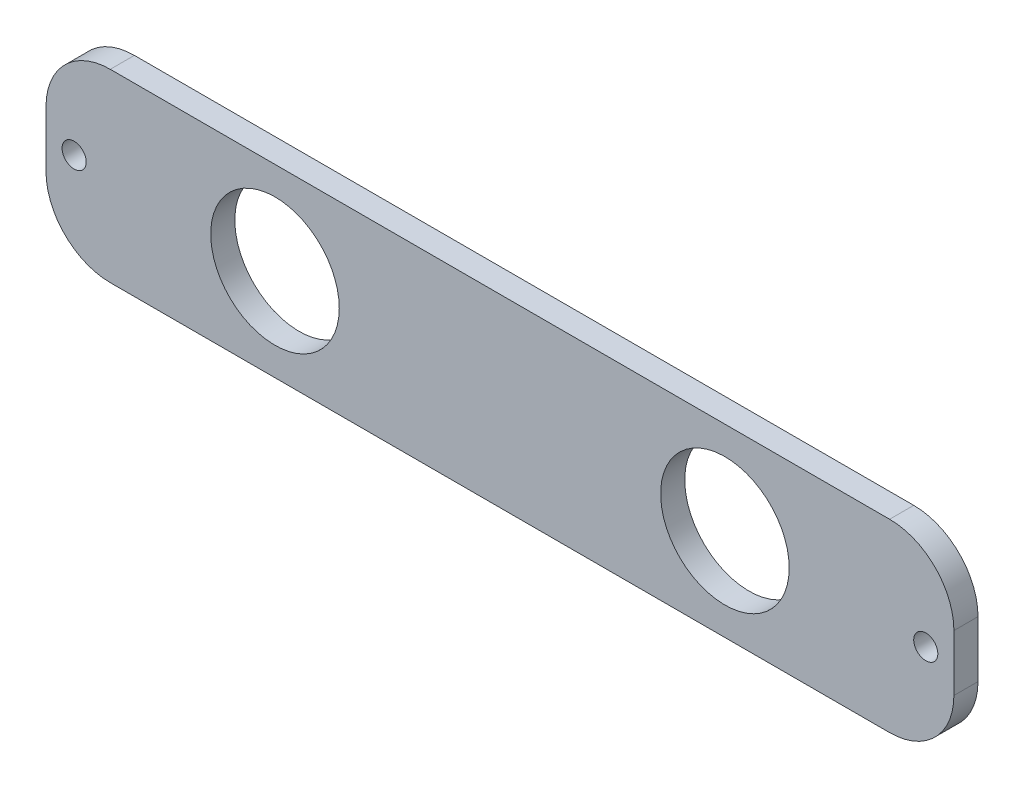
ISO-10303-21;
HEADER;
FILE_DESCRIPTION(('STEP AP214'),'2;1');
FILE_NAME('part.step','',(''),(''),'','','');
FILE_SCHEMA(('AUTOMOTIVE_DESIGN { 1 0 10303 214 1 1 1 1 }'));
ENDSEC;
DATA;
#1=APPLICATION_CONTEXT('core data for automotive mechanical design processes');
#2=APPLICATION_PROTOCOL_DEFINITION('international standard','automotive_design',2000,#1);
#3=PRODUCT_CONTEXT('',#1,'mechanical');
#4=PRODUCT('Part','Part','',(#3));
#5=PRODUCT_RELATED_PRODUCT_CATEGORY('part','',(#4));
#6=PRODUCT_DEFINITION_FORMATION('','',#4);
#7=PRODUCT_DEFINITION_CONTEXT('part definition',#1,'design');
#8=PRODUCT_DEFINITION('design','',#6,#7);
#9=PRODUCT_DEFINITION_SHAPE('','',#8);
#10=(LENGTH_UNIT() NAMED_UNIT(*) SI_UNIT(.MILLI.,.METRE.));
#11=(NAMED_UNIT(*) PLANE_ANGLE_UNIT() SI_UNIT($,.RADIAN.));
#12=(NAMED_UNIT(*) SI_UNIT($,.STERADIAN.) SOLID_ANGLE_UNIT());
#13=UNCERTAINTY_MEASURE_WITH_UNIT(LENGTH_MEASURE(1.E-05),#10,'distance_accuracy_value','');
#14=(GEOMETRIC_REPRESENTATION_CONTEXT(3) GLOBAL_UNCERTAINTY_ASSIGNED_CONTEXT((#13)) GLOBAL_UNIT_ASSIGNED_CONTEXT((#10,
#11,#12)) REPRESENTATION_CONTEXT('',''));
#15=CARTESIAN_POINT('',(0.,0.,0.));
#16=DIRECTION('',(0.,0.,1.));
#17=DIRECTION('',(1.,0.,0.));
#18=AXIS2_PLACEMENT_3D('',#15,#16,#17);
#19=CARTESIAN_POINT('',(-41.4187681974267,22.5585174516787,3.));
#20=DIRECTION('',(0.,0.,-1.));
#21=DIRECTION('',(-1.,0.,0.));
#22=AXIS2_PLACEMENT_3D('',#19,#20,#21);
#23=CYLINDRICAL_SURFACE('',#22,8.);
#24=CARTESIAN_POINT('',(-41.4187681974267,22.5585174516787,0.));
#25=DIRECTION('',(0.,0.,-1.));
#26=DIRECTION('',(-1.,0.,0.));
#27=AXIS2_PLACEMENT_3D('',#24,#25,#26);
#28=CIRCLE('',#27,8.);
#29=CARTESIAN_POINT('',(-49.4187681974267,22.5585174516787,0.));
#30=VERTEX_POINT('',#29);
#31=CARTESIAN_POINT('',(-41.4187681974267,30.5585174516787,0.));
#32=VERTEX_POINT('',#31);
#33=EDGE_CURVE('E140',#30,#32,#28,.T.);
#34=ORIENTED_EDGE('',*,*,#33,.F.);
#35=DIRECTION('',(0.,0.,-1.));
#36=VECTOR('',#35,1.);
#37=CARTESIAN_POINT('',(-49.4187681974267,22.5585174516787,3.));
#38=LINE('',#37,#36);
#39=CARTESIAN_POINT('',(-49.4187681974267,22.5585174516787,3.));
#40=VERTEX_POINT('',#39);
#41=EDGE_CURVE('E11',#40,#30,#38,.T.);
#42=ORIENTED_EDGE('',*,*,#41,.F.);
#43=CARTESIAN_POINT('',(-41.4187681974267,22.5585174516787,3.));
#44=DIRECTION('',(0.,0.,-1.));
#45=DIRECTION('',(-1.,0.,0.));
#46=AXIS2_PLACEMENT_3D('',#43,#44,#45);
#47=CIRCLE('',#46,8.);
#48=CARTESIAN_POINT('',(-41.4187681974267,30.5585174516787,3.));
#49=VERTEX_POINT('',#48);
#50=EDGE_CURVE('E158',#40,#49,#47,.T.);
#51=ORIENTED_EDGE('',*,*,#50,.T.);
#52=DIRECTION('',(0.,0.,-1.));
#53=VECTOR('',#52,1.);
#54=CARTESIAN_POINT('',(-41.4187681974267,30.5585174516787,3.));
#55=LINE('',#54,#53);
#56=EDGE_CURVE('E48',#49,#32,#55,.T.);
#57=ORIENTED_EDGE('',*,*,#56,.T.);
#58=EDGE_LOOP('',(#34,#42,#51,#57));
#59=FACE_BOUND('',#58,.T.);
#60=ADVANCED_FACE('F45',(#59),#23,.T.);
#61=CARTESIAN_POINT('',(-49.4187681974267,22.5585174516787,3.));
#62=DIRECTION('',(1.,0.,0.));
#63=DIRECTION('',(0.,0.,-1.));
#64=AXIS2_PLACEMENT_3D('',#61,#62,#63);
#65=PLANE('',#64);
#66=DIRECTION('',(0.,-1.,0.));
#67=VECTOR('',#66,1.);
#68=CARTESIAN_POINT('',(-49.4187681974267,22.5585174516787,0.));
#69=LINE('',#68,#67);
#70=CARTESIAN_POINT('',(-49.4187681974267,15.5585174516787,0.));
#71=VERTEX_POINT('',#70);
#72=EDGE_CURVE('E157',#30,#71,#69,.T.);
#73=ORIENTED_EDGE('',*,*,#72,.T.);
#74=DIRECTION('',(0.,0.,-1.));
#75=VECTOR('',#74,1.);
#76=CARTESIAN_POINT('',(-49.4187681974267,15.5585174516787,3.));
#77=LINE('',#76,#75);
#78=CARTESIAN_POINT('',(-49.4187681974267,15.5585174516787,3.));
#79=VERTEX_POINT('',#78);
#80=EDGE_CURVE('E54',#79,#71,#77,.T.);
#81=ORIENTED_EDGE('',*,*,#80,.F.);
#82=DIRECTION('',(0.,-1.,0.));
#83=VECTOR('',#82,1.);
#84=CARTESIAN_POINT('',(-49.4187681974267,22.5585174516787,3.));
#85=LINE('',#84,#83);
#86=EDGE_CURVE('E135',#40,#79,#85,.T.);
#87=ORIENTED_EDGE('',*,*,#86,.F.);
#88=ORIENTED_EDGE('',*,*,#41,.T.);
#89=EDGE_LOOP('',(#73,#81,#87,#88));
#90=FACE_BOUND('',#89,.T.);
#91=ADVANCED_FACE('F173',(#90),#65,.F.);
#92=CARTESIAN_POINT('',(-41.4187681974267,15.5585174516787,3.));
#93=DIRECTION('',(0.,0.,-1.));
#94=DIRECTION('',(-1.,0.,0.));
#95=AXIS2_PLACEMENT_3D('',#92,#93,#94);
#96=CYLINDRICAL_SURFACE('',#95,8.);
#97=CARTESIAN_POINT('',(-41.4187681974267,15.5585174516787,0.));
#98=DIRECTION('',(0.,0.,-1.));
#99=DIRECTION('',(-1.,0.,0.));
#100=AXIS2_PLACEMENT_3D('',#97,#98,#99);
#101=CIRCLE('',#100,8.);
#102=CARTESIAN_POINT('',(-41.4187681974267,7.55851745167872,0.));
#103=VERTEX_POINT('',#102);
#104=EDGE_CURVE('E120',#103,#71,#101,.T.);
#105=ORIENTED_EDGE('',*,*,#104,.F.);
#106=DIRECTION('',(0.,0.,-1.));
#107=VECTOR('',#106,1.);
#108=CARTESIAN_POINT('',(-41.4187681974267,7.55851745167872,3.));
#109=LINE('',#108,#107);
#110=CARTESIAN_POINT('',(-41.4187681974267,7.55851745167872,3.));
#111=VERTEX_POINT('',#110);
#112=EDGE_CURVE('E114',#111,#103,#109,.T.);
#113=ORIENTED_EDGE('',*,*,#112,.F.);
#114=CARTESIAN_POINT('',(-41.4187681974267,15.5585174516787,3.));
#115=DIRECTION('',(0.,0.,-1.));
#116=DIRECTION('',(-1.,0.,0.));
#117=AXIS2_PLACEMENT_3D('',#114,#115,#116);
#118=CIRCLE('',#117,8.);
#119=EDGE_CURVE('E118',#111,#79,#118,.T.);
#120=ORIENTED_EDGE('',*,*,#119,.T.);
#121=ORIENTED_EDGE('',*,*,#80,.T.);
#122=EDGE_LOOP('',(#105,#113,#120,#121));
#123=FACE_BOUND('',#122,.T.);
#124=ADVANCED_FACE('F116',(#123),#96,.T.);
#125=CARTESIAN_POINT('',(-41.4187681974267,7.55851745167872,3.));
#126=DIRECTION('',(0.,1.,0.));
#127=DIRECTION('',(0.,0.,1.));
#128=AXIS2_PLACEMENT_3D('',#125,#126,#127);
#129=PLANE('',#128);
#130=DIRECTION('',(1.,0.,0.));
#131=VECTOR('',#130,1.);
#132=CARTESIAN_POINT('',(-41.4187681974267,7.55851745167872,0.));
#133=LINE('',#132,#131);
#134=CARTESIAN_POINT('',(55.5812318025732,7.55851745167872,0.));
#135=VERTEX_POINT('',#134);
#136=EDGE_CURVE('E154',#103,#135,#133,.T.);
#137=ORIENTED_EDGE('',*,*,#136,.T.);
#138=DIRECTION('',(0.,0.,-1.));
#139=VECTOR('',#138,1.);
#140=CARTESIAN_POINT('',(55.5812318025732,7.55851745167872,3.));
#141=LINE('',#140,#139);
#142=CARTESIAN_POINT('',(55.5812318025732,7.55851745167872,3.));
#143=VERTEX_POINT('',#142);
#144=EDGE_CURVE('E123',#143,#135,#141,.T.);
#145=ORIENTED_EDGE('',*,*,#144,.F.);
#146=DIRECTION('',(1.,0.,0.));
#147=VECTOR('',#146,1.);
#148=CARTESIAN_POINT('',(-41.4187681974267,7.55851745167872,3.));
#149=LINE('',#148,#147);
#150=EDGE_CURVE('E126',#111,#143,#149,.T.);
#151=ORIENTED_EDGE('',*,*,#150,.F.);
#152=ORIENTED_EDGE('',*,*,#112,.T.);
#153=EDGE_LOOP('',(#137,#145,#151,#152));
#154=FACE_BOUND('',#153,.T.);
#155=ADVANCED_FACE('F127',(#154),#129,.F.);
#156=CARTESIAN_POINT('',(55.5812318025733,15.5585174516787,3.));
#157=DIRECTION('',(0.,0.,-1.));
#158=DIRECTION('',(-1.,0.,0.));
#159=AXIS2_PLACEMENT_3D('',#156,#157,#158);
#160=CYLINDRICAL_SURFACE('',#159,8.);
#161=CARTESIAN_POINT('',(55.5812318025733,15.5585174516787,0.));
#162=DIRECTION('',(0.,0.,1.));
#163=DIRECTION('',(1.,0.,0.));
#164=AXIS2_PLACEMENT_3D('',#161,#162,#163);
#165=CIRCLE('',#164,8.);
#166=CARTESIAN_POINT('',(63.5812318025733,15.5585174516788,0.));
#167=VERTEX_POINT('',#166);
#168=EDGE_CURVE('E152',#135,#167,#165,.T.);
#169=ORIENTED_EDGE('',*,*,#168,.T.);
#170=DIRECTION('',(0.,0.,-1.));
#171=VECTOR('',#170,1.);
#172=CARTESIAN_POINT('',(63.5812318025733,15.5585174516788,3.));
#173=LINE('',#172,#171);
#174=CARTESIAN_POINT('',(63.5812318025733,15.5585174516788,3.));
#175=VERTEX_POINT('',#174);
#176=EDGE_CURVE('E162',#175,#167,#173,.T.);
#177=ORIENTED_EDGE('',*,*,#176,.F.);
#178=CARTESIAN_POINT('',(55.5812318025733,15.5585174516787,3.));
#179=DIRECTION('',(0.,0.,1.));
#180=DIRECTION('',(1.,0.,0.));
#181=AXIS2_PLACEMENT_3D('',#178,#179,#180);
#182=CIRCLE('',#181,8.);
#183=EDGE_CURVE('E131',#143,#175,#182,.T.);
#184=ORIENTED_EDGE('',*,*,#183,.F.);
#185=ORIENTED_EDGE('',*,*,#144,.T.);
#186=EDGE_LOOP('',(#169,#177,#184,#185));
#187=FACE_BOUND('',#186,.T.);
#188=ADVANCED_FACE('F188',(#187),#160,.T.);
#189=CARTESIAN_POINT('',(63.5812318025733,15.5585174516788,3.));
#190=DIRECTION('',(-1.,0.,0.));
#191=DIRECTION('',(0.,0.,1.));
#192=AXIS2_PLACEMENT_3D('',#189,#190,#191);
#193=PLANE('',#192);
#194=DIRECTION('',(0.,1.,0.));
#195=VECTOR('',#194,1.);
#196=CARTESIAN_POINT('',(63.5812318025733,15.5585174516788,0.));
#197=LINE('',#196,#195);
#198=CARTESIAN_POINT('',(63.5812318025733,22.5585174516787,0.));
#199=VERTEX_POINT('',#198);
#200=EDGE_CURVE('E150',#167,#199,#197,.T.);
#201=ORIENTED_EDGE('',*,*,#200,.T.);
#202=DIRECTION('',(0.,0.,-1.));
#203=VECTOR('',#202,1.);
#204=CARTESIAN_POINT('',(63.5812318025733,22.5585174516787,3.));
#205=LINE('',#204,#203);
#206=CARTESIAN_POINT('',(63.5812318025733,22.5585174516787,3.));
#207=VERTEX_POINT('',#206);
#208=EDGE_CURVE('E165',#207,#199,#205,.T.);
#209=ORIENTED_EDGE('',*,*,#208,.F.);
#210=DIRECTION('',(0.,1.,0.));
#211=VECTOR('',#210,1.);
#212=CARTESIAN_POINT('',(63.5812318025733,15.5585174516788,3.));
#213=LINE('',#212,#211);
#214=EDGE_CURVE('E183',#175,#207,#213,.T.);
#215=ORIENTED_EDGE('',*,*,#214,.F.);
#216=ORIENTED_EDGE('',*,*,#176,.T.);
#217=EDGE_LOOP('',(#201,#209,#215,#216));
#218=FACE_BOUND('',#217,.T.);
#219=ADVANCED_FACE('F192',(#218),#193,.F.);
#220=CARTESIAN_POINT('',(55.5812318025733,22.5585174516787,3.));
#221=DIRECTION('',(0.,0.,-1.));
#222=DIRECTION('',(-1.,0.,0.));
#223=AXIS2_PLACEMENT_3D('',#220,#221,#222);
#224=CYLINDRICAL_SURFACE('',#223,8.);
#225=CARTESIAN_POINT('',(55.5812318025733,22.5585174516787,0.));
#226=DIRECTION('',(0.,0.,1.));
#227=DIRECTION('',(1.,0.,0.));
#228=AXIS2_PLACEMENT_3D('',#225,#226,#227);
#229=CIRCLE('',#228,8.);
#230=CARTESIAN_POINT('',(55.5812318025732,30.5585174516787,0.));
#231=VERTEX_POINT('',#230);
#232=EDGE_CURVE('E147',#199,#231,#229,.T.);
#233=ORIENTED_EDGE('',*,*,#232,.T.);
#234=DIRECTION('',(0.,0.,-1.));
#235=VECTOR('',#234,1.);
#236=CARTESIAN_POINT('',(55.5812318025732,30.5585174516787,3.));
#237=LINE('',#236,#235);
#238=CARTESIAN_POINT('',(55.5812318025732,30.5585174516787,3.));
#239=VERTEX_POINT('',#238);
#240=EDGE_CURVE('E167',#239,#231,#237,.T.);
#241=ORIENTED_EDGE('',*,*,#240,.F.);
#242=CARTESIAN_POINT('',(55.5812318025733,22.5585174516787,3.));
#243=DIRECTION('',(0.,0.,1.));
#244=DIRECTION('',(1.,0.,0.));
#245=AXIS2_PLACEMENT_3D('',#242,#243,#244);
#246=CIRCLE('',#245,8.);
#247=EDGE_CURVE('E176',#207,#239,#246,.T.);
#248=ORIENTED_EDGE('',*,*,#247,.F.);
#249=ORIENTED_EDGE('',*,*,#208,.T.);
#250=EDGE_LOOP('',(#233,#241,#248,#249));
#251=FACE_BOUND('',#250,.T.);
#252=ADVANCED_FACE('F195',(#251),#224,.T.);
#253=CARTESIAN_POINT('',(-41.4187681974267,30.5585174516787,3.));
#254=DIRECTION('',(0.,1.,0.));
#255=DIRECTION('',(0.,0.,1.));
#256=AXIS2_PLACEMENT_3D('',#253,#254,#255);
#257=PLANE('',#256);
#258=DIRECTION('',(1.,0.,0.));
#259=VECTOR('',#258,1.);
#260=CARTESIAN_POINT('',(-41.4187681974267,30.5585174516787,0.));
#261=LINE('',#260,#259);
#262=EDGE_CURVE('E143',#32,#231,#261,.T.);
#263=ORIENTED_EDGE('',*,*,#262,.F.);
#264=ORIENTED_EDGE('',*,*,#56,.F.);
#265=DIRECTION('',(1.,0.,0.));
#266=VECTOR('',#265,1.);
#267=CARTESIAN_POINT('',(-41.4187681974267,30.5585174516787,3.));
#268=LINE('',#267,#266);
#269=EDGE_CURVE('E174',#49,#239,#268,.T.);
#270=ORIENTED_EDGE('',*,*,#269,.T.);
#271=ORIENTED_EDGE('',*,*,#240,.T.);
#272=EDGE_LOOP('',(#263,#264,#270,#271));
#273=FACE_BOUND('',#272,.T.);
#274=ADVANCED_FACE('F169',(#273),#257,.T.);
#275=CARTESIAN_POINT('',(-41.4187681974267,22.5585174516787,3.));
#276=DIRECTION('',(0.,0.,-1.));
#277=DIRECTION('',(-1.,0.,0.));
#278=AXIS2_PLACEMENT_3D('',#275,#276,#277);
#279=PLANE('',#278);
#280=CARTESIAN_POINT('',(-45.9187681974267,19.0585174516787,3.));
#281=DIRECTION('',(0.,0.,1.));
#282=DIRECTION('',(1.,0.,0.));
#283=AXIS2_PLACEMENT_3D('',#280,#281,#282);
#284=CIRCLE('',#283,1.5);
#285=CARTESIAN_POINT('',(-44.4187681974267,19.0585174516787,3.));
#286=VERTEX_POINT('',#285);
#287=EDGE_CURVE('E302',#286,#286,#284,.T.);
#288=ORIENTED_EDGE('',*,*,#287,.F.);
#289=EDGE_LOOP('',(#288));
#290=FACE_BOUND('',#289,.T.);
#291=CARTESIAN_POINT('',(35.0812318025733,19.0585174516787,3.));
#292=DIRECTION('',(0.,0.,1.));
#293=DIRECTION('',(1.,0.,0.));
#294=AXIS2_PLACEMENT_3D('',#291,#292,#293);
#295=CIRCLE('',#294,8.);
#296=CARTESIAN_POINT('',(43.0812318025733,19.0585174516787,3.));
#297=VERTEX_POINT('',#296);
#298=EDGE_CURVE('E310',#297,#297,#295,.T.);
#299=ORIENTED_EDGE('',*,*,#298,.F.);
#300=EDGE_LOOP('',(#299));
#301=FACE_BOUND('',#300,.T.);
#302=CARTESIAN_POINT('',(-20.9187681974267,19.0585174516787,3.));
#303=DIRECTION('',(0.,0.,1.));
#304=DIRECTION('',(1.,0.,0.));
#305=AXIS2_PLACEMENT_3D('',#302,#303,#304);
#306=CIRCLE('',#305,8.);
#307=CARTESIAN_POINT('',(-12.9187681974267,19.0585174516787,3.));
#308=VERTEX_POINT('',#307);
#309=EDGE_CURVE('E317',#308,#308,#306,.T.);
#310=ORIENTED_EDGE('',*,*,#309,.F.);
#311=EDGE_LOOP('',(#310));
#312=FACE_BOUND('',#311,.T.);
#313=CARTESIAN_POINT('',(60.0812318025733,19.0585174516787,3.));
#314=DIRECTION('',(0.,0.,1.));
#315=DIRECTION('',(1.,0.,0.));
#316=AXIS2_PLACEMENT_3D('',#313,#314,#315);
#317=CIRCLE('',#316,1.5);
#318=CARTESIAN_POINT('',(61.5812318025733,19.0585174516787,3.));
#319=VERTEX_POINT('',#318);
#320=EDGE_CURVE('E303',#319,#319,#317,.T.);
#321=ORIENTED_EDGE('',*,*,#320,.F.);
#322=EDGE_LOOP('',(#321));
#323=FACE_BOUND('',#322,.T.);
#324=ORIENTED_EDGE('',*,*,#50,.F.);
#325=ORIENTED_EDGE('',*,*,#86,.T.);
#326=ORIENTED_EDGE('',*,*,#119,.F.);
#327=ORIENTED_EDGE('',*,*,#150,.T.);
#328=ORIENTED_EDGE('',*,*,#183,.T.);
#329=ORIENTED_EDGE('',*,*,#214,.T.);
#330=ORIENTED_EDGE('',*,*,#247,.T.);
#331=ORIENTED_EDGE('',*,*,#269,.F.);
#332=EDGE_LOOP('',(#324,#325,#326,#327,#328,#329,#330,#331));
#333=FACE_BOUND('',#332,.T.);
#334=ADVANCED_FACE('F134',(#290,#301,#312,#323,#333),#279,.F.);
#335=CARTESIAN_POINT('',(-41.4187681974267,22.5585174516787,0.));
#336=DIRECTION('',(0.,0.,-1.));
#337=DIRECTION('',(-1.,0.,0.));
#338=AXIS2_PLACEMENT_3D('',#335,#336,#337);
#339=PLANE('',#338);
#340=CARTESIAN_POINT('',(-45.9187681974267,19.0585174516787,0.));
#341=DIRECTION('',(0.,0.,1.));
#342=DIRECTION('',(1.,0.,0.));
#343=AXIS2_PLACEMENT_3D('',#340,#341,#342);
#344=CIRCLE('',#343,1.5);
#345=CARTESIAN_POINT('',(-44.4187681974267,19.0585174516787,0.));
#346=VERTEX_POINT('',#345);
#347=EDGE_CURVE('E144',#346,#346,#344,.T.);
#348=ORIENTED_EDGE('',*,*,#347,.T.);
#349=EDGE_LOOP('',(#348));
#350=FACE_BOUND('',#349,.T.);
#351=CARTESIAN_POINT('',(35.0812318025733,19.0585174516787,0.));
#352=DIRECTION('',(0.,0.,1.));
#353=DIRECTION('',(1.,0.,0.));
#354=AXIS2_PLACEMENT_3D('',#351,#352,#353);
#355=CIRCLE('',#354,8.);
#356=CARTESIAN_POINT('',(43.0812318025733,19.0585174516787,0.));
#357=VERTEX_POINT('',#356);
#358=EDGE_CURVE('E313',#357,#357,#355,.T.);
#359=ORIENTED_EDGE('',*,*,#358,.T.);
#360=EDGE_LOOP('',(#359));
#361=FACE_BOUND('',#360,.T.);
#362=CARTESIAN_POINT('',(-20.9187681974267,19.0585174516787,0.));
#363=DIRECTION('',(0.,0.,1.));
#364=DIRECTION('',(1.,0.,0.));
#365=AXIS2_PLACEMENT_3D('',#362,#363,#364);
#366=CIRCLE('',#365,8.);
#367=CARTESIAN_POINT('',(-12.9187681974267,19.0585174516787,0.));
#368=VERTEX_POINT('',#367);
#369=EDGE_CURVE('E179',#368,#368,#366,.T.);
#370=ORIENTED_EDGE('',*,*,#369,.T.);
#371=EDGE_LOOP('',(#370));
#372=FACE_BOUND('',#371,.T.);
#373=CARTESIAN_POINT('',(60.0812318025733,19.0585174516787,0.));
#374=DIRECTION('',(0.,0.,1.));
#375=DIRECTION('',(1.,0.,0.));
#376=AXIS2_PLACEMENT_3D('',#373,#374,#375);
#377=CIRCLE('',#376,1.5);
#378=CARTESIAN_POINT('',(61.5812318025733,19.0585174516787,0.));
#379=VERTEX_POINT('',#378);
#380=EDGE_CURVE('E307',#379,#379,#377,.T.);
#381=ORIENTED_EDGE('',*,*,#380,.T.);
#382=EDGE_LOOP('',(#381));
#383=FACE_BOUND('',#382,.T.);
#384=ORIENTED_EDGE('',*,*,#33,.T.);
#385=ORIENTED_EDGE('',*,*,#262,.T.);
#386=ORIENTED_EDGE('',*,*,#232,.F.);
#387=ORIENTED_EDGE('',*,*,#200,.F.);
#388=ORIENTED_EDGE('',*,*,#168,.F.);
#389=ORIENTED_EDGE('',*,*,#136,.F.);
#390=ORIENTED_EDGE('',*,*,#104,.T.);
#391=ORIENTED_EDGE('',*,*,#72,.F.);
#392=EDGE_LOOP('',(#384,#385,#386,#387,#388,#389,#390,#391));
#393=FACE_BOUND('',#392,.T.);
#394=ADVANCED_FACE('F172',(#350,#361,#372,#383,#393),#339,.T.);
#395=CARTESIAN_POINT('',(60.0812318025733,19.0585174516787,0.));
#396=DIRECTION('',(0.,0.,1.));
#397=DIRECTION('',(1.,0.,0.));
#398=AXIS2_PLACEMENT_3D('',#395,#396,#397);
#399=CYLINDRICAL_SURFACE('',#398,1.5);
#400=ORIENTED_EDGE('',*,*,#380,.F.);
#401=EDGE_LOOP('',(#400));
#402=FACE_BOUND('',#401,.T.);
#403=ORIENTED_EDGE('',*,*,#320,.T.);
#404=EDGE_LOOP('',(#403));
#405=FACE_BOUND('',#404,.T.);
#406=ADVANCED_FACE('F255',(#402,#405),#399,.F.);
#407=CARTESIAN_POINT('',(-20.9187681974267,19.0585174516787,0.));
#408=DIRECTION('',(0.,0.,1.));
#409=DIRECTION('',(1.,0.,0.));
#410=AXIS2_PLACEMENT_3D('',#407,#408,#409);
#411=CYLINDRICAL_SURFACE('',#410,8.);
#412=ORIENTED_EDGE('',*,*,#369,.F.);
#413=EDGE_LOOP('',(#412));
#414=FACE_BOUND('',#413,.T.);
#415=ORIENTED_EDGE('',*,*,#309,.T.);
#416=EDGE_LOOP('',(#415));
#417=FACE_BOUND('',#416,.T.);
#418=ADVANCED_FACE('F264',(#414,#417),#411,.F.);
#419=CARTESIAN_POINT('',(35.0812318025733,19.0585174516787,0.));
#420=DIRECTION('',(0.,0.,1.));
#421=DIRECTION('',(1.,0.,0.));
#422=AXIS2_PLACEMENT_3D('',#419,#420,#421);
#423=CYLINDRICAL_SURFACE('',#422,8.);
#424=ORIENTED_EDGE('',*,*,#358,.F.);
#425=EDGE_LOOP('',(#424));
#426=FACE_BOUND('',#425,.T.);
#427=ORIENTED_EDGE('',*,*,#298,.T.);
#428=EDGE_LOOP('',(#427));
#429=FACE_BOUND('',#428,.T.);
#430=ADVANCED_FACE('F274',(#426,#429),#423,.F.);
#431=CARTESIAN_POINT('',(-45.9187681974267,19.0585174516787,0.));
#432=DIRECTION('',(0.,0.,1.));
#433=DIRECTION('',(1.,0.,0.));
#434=AXIS2_PLACEMENT_3D('',#431,#432,#433);
#435=CYLINDRICAL_SURFACE('',#434,1.5);
#436=ORIENTED_EDGE('',*,*,#347,.F.);
#437=EDGE_LOOP('',(#436));
#438=FACE_BOUND('',#437,.T.);
#439=ORIENTED_EDGE('',*,*,#287,.T.);
#440=EDGE_LOOP('',(#439));
#441=FACE_BOUND('',#440,.T.);
#442=ADVANCED_FACE('F284',(#438,#441),#435,.F.);
#443=CLOSED_SHELL('',(#60,#91,#124,#155,#188,#219,#252,#274,#334,#394,#406,#418,#430,#442));
#444=MANIFOLD_SOLID_BREP('B2',#443);
#445=ADVANCED_BREP_SHAPE_REPRESENTATION('',(#18,#444),#14);
#446=SHAPE_DEFINITION_REPRESENTATION(#9,#445);
ENDSEC;
END-ISO-10303-21;
